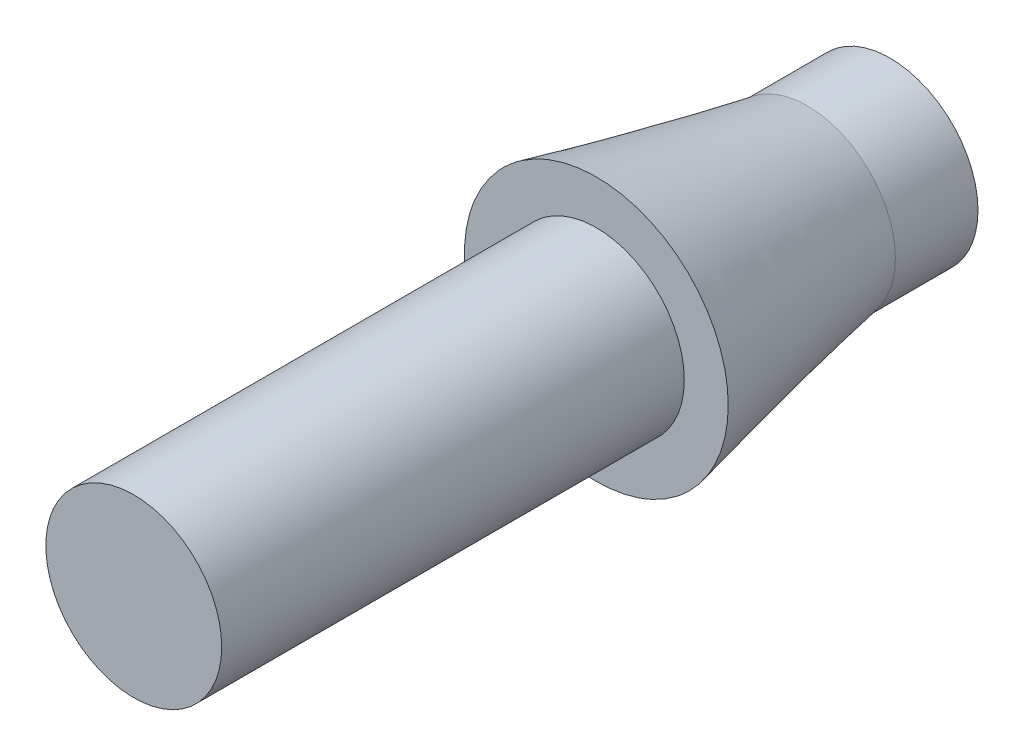
ISO-10303-21;
HEADER;
FILE_DESCRIPTION(('STEP AP214'),'2;1');
FILE_NAME('part.step','',(''),(''),'','','');
FILE_SCHEMA(('AUTOMOTIVE_DESIGN { 1 0 10303 214 1 1 1 1 }'));
ENDSEC;
DATA;
#1=APPLICATION_CONTEXT('core data for automotive mechanical design processes');
#2=APPLICATION_PROTOCOL_DEFINITION('international standard','automotive_design',2000,#1);
#3=PRODUCT_CONTEXT('',#1,'mechanical');
#4=PRODUCT('Part','Part','',(#3));
#5=PRODUCT_RELATED_PRODUCT_CATEGORY('part','',(#4));
#6=PRODUCT_DEFINITION_FORMATION('','',#4);
#7=PRODUCT_DEFINITION_CONTEXT('part definition',#1,'design');
#8=PRODUCT_DEFINITION('design','',#6,#7);
#9=PRODUCT_DEFINITION_SHAPE('','',#8);
#10=(LENGTH_UNIT() NAMED_UNIT(*) SI_UNIT(.MILLI.,.METRE.));
#11=(NAMED_UNIT(*) PLANE_ANGLE_UNIT() SI_UNIT($,.RADIAN.));
#12=(NAMED_UNIT(*) SI_UNIT($,.STERADIAN.) SOLID_ANGLE_UNIT());
#13=UNCERTAINTY_MEASURE_WITH_UNIT(LENGTH_MEASURE(1.E-05),#10,'distance_accuracy_value','');
#14=(GEOMETRIC_REPRESENTATION_CONTEXT(3) GLOBAL_UNCERTAINTY_ASSIGNED_CONTEXT((#13)) GLOBAL_UNIT_ASSIGNED_CONTEXT((#10,
#11,#12)) REPRESENTATION_CONTEXT('',''));
#15=CARTESIAN_POINT('',(0.,0.,0.));
#16=DIRECTION('',(0.,0.,1.));
#17=DIRECTION('',(1.,0.,0.));
#18=AXIS2_PLACEMENT_3D('',#15,#16,#17);
#19=CARTESIAN_POINT('',(0.,0.,43.));
#20=DIRECTION('',(0.,0.,-1.));
#21=DIRECTION('',(-1.,0.,0.));
#22=AXIS2_PLACEMENT_3D('',#19,#20,#21);
#23=CYLINDRICAL_SURFACE('',#22,5.);
#24=CARTESIAN_POINT('',(0.,0.,16.7));
#25=DIRECTION('',(0.,0.,1.));
#26=DIRECTION('',(1.,0.,0.));
#27=AXIS2_PLACEMENT_3D('',#24,#25,#26);
#28=CIRCLE('',#27,5.);
#29=CARTESIAN_POINT('',(5.,0.,16.7));
#30=VERTEX_POINT('',#29);
#31=EDGE_CURVE('E45',#30,#30,#28,.T.);
#32=ORIENTED_EDGE('',*,*,#31,.T.);
#33=EDGE_LOOP('',(#32));
#34=FACE_BOUND('',#33,.T.);
#35=CARTESIAN_POINT('',(0.,0.,43.));
#36=DIRECTION('',(0.,0.,1.));
#37=DIRECTION('',(1.,0.,0.));
#38=AXIS2_PLACEMENT_3D('',#35,#36,#37);
#39=CIRCLE('',#38,5.);
#40=CARTESIAN_POINT('',(5.,0.,43.));
#41=VERTEX_POINT('',#40);
#42=EDGE_CURVE('E49',#41,#41,#39,.T.);
#43=ORIENTED_EDGE('',*,*,#42,.F.);
#44=EDGE_LOOP('',(#43));
#45=FACE_BOUND('',#44,.T.);
#46=ADVANCED_FACE('F41',(#34,#45),#23,.T.);
#47=CARTESIAN_POINT('',(0.,0.,43.));
#48=DIRECTION('',(0.,0.,1.));
#49=DIRECTION('',(1.,0.,0.));
#50=AXIS2_PLACEMENT_3D('',#47,#48,#49);
#51=PLANE('',#50);
#52=ORIENTED_EDGE('',*,*,#42,.T.);
#53=EDGE_LOOP('',(#52));
#54=FACE_BOUND('',#53,.T.);
#55=ADVANCED_FACE('F83',(#54),#51,.T.);
#56=CARTESIAN_POINT('',(0.,0.,16.7));
#57=DIRECTION('',(0.,0.,1.));
#58=DIRECTION('',(1.,0.,0.));
#59=AXIS2_PLACEMENT_3D('',#56,#57,#58);
#60=PLANE('',#59);
#61=ORIENTED_EDGE('',*,*,#31,.F.);
#62=EDGE_LOOP('',(#61));
#63=FACE_BOUND('',#62,.T.);
#64=CARTESIAN_POINT('',(0.,0.,16.7));
#65=DIRECTION('',(0.,0.,1.));
#66=DIRECTION('',(1.,0.,0.));
#67=AXIS2_PLACEMENT_3D('',#64,#65,#66);
#68=CIRCLE('',#67,7.5);
#69=CARTESIAN_POINT('',(7.5,0.,16.7));
#70=VERTEX_POINT('',#69);
#71=EDGE_CURVE('E95',#70,#70,#68,.T.);
#72=ORIENTED_EDGE('',*,*,#71,.T.);
#73=EDGE_LOOP('',(#72));
#74=FACE_BOUND('',#73,.T.);
#75=ADVANCED_FACE('F89',(#63,#74),#60,.T.);
#76=CARTESIAN_POINT('',(3.92275643369188,-6.39233775405594,16.7));
#77=CARTESIAN_POINT('',(3.83044658146429,-3.21367064064576,4.7));
#78=CARTESIAN_POINT('',(-8.86191907442001,-14.2378506214397,16.7));
#79=CARTESIAN_POINT('',(-2.59689469982724,-10.8745638035743,4.7));
#80=CARTESIAN_POINT('',(-16.7074319418038,-1.45317511332781,16.7));
#81=CARTESIAN_POINT('',(-10.2577878627558,-4.44722252228281,4.7));
#82=CARTESIAN_POINT('',(-3.92275643369188,6.39233775405594,16.7));
#83=CARTESIAN_POINT('',(-3.83044658146429,3.21367064064576,4.7));
#84=CARTESIAN_POINT('',(8.86191907442001,14.2378506214397,16.7));
#85=CARTESIAN_POINT('',(2.59689469982724,10.8745638035743,4.7));
#86=CARTESIAN_POINT('',(16.7074319418038,1.45317511332781,16.7));
#87=CARTESIAN_POINT('',(10.2577878627558,4.44722252228281,4.7));
#88=CARTESIAN_POINT('',(3.92275643369188,-6.39233775405594,16.7));
#89=CARTESIAN_POINT('',(3.83044658146429,-3.21367064064576,4.7));
#90=(BOUNDED_SURFACE() B_SPLINE_SURFACE(3,1,((#76,#77),(#78,#79),(#80,#81),(#82,#83),(#84,#85),
(#86,#87),(#88,#89)),.UNSPECIFIED.,.T.,.F.,.F.) B_SPLINE_SURFACE_WITH_KNOTS((4,3,4),(2,2),(0.,
0.5,1.),(0.,1.),.UNSPECIFIED.) GEOMETRIC_REPRESENTATION_ITEM() RATIONAL_B_SPLINE_SURFACE(((1.,
1.),(0.333333333333333,0.333333333333333),(0.333333333333333,0.333333333333333),(1.,1.),
(0.333333333333333,0.333333333333333),(0.333333333333333,0.333333333333333),(1.,1.))) REPRESENTATION_ITEM('') SURFACE());
#91=CARTESIAN_POINT('',(3.83044658146429,-3.21367064064577,4.70000000000002));
#92=CARTESIAN_POINT('',(10.2577878627558,4.44722252228281,4.70000000000002));
#93=CARTESIAN_POINT('',(2.59689469982725,10.8745638035743,4.70000000000002));
#94=CARTESIAN_POINT('',(-3.83044658146429,3.21367064064577,4.70000000000002));
#95=CARTESIAN_POINT('',(-10.2577878627558,-4.44722252228281,4.70000000000002));
#96=CARTESIAN_POINT('',(-2.59689469982725,-10.8745638035743,4.70000000000002));
#97=CARTESIAN_POINT('',(3.83044658146429,-3.21367064064577,4.70000000000002));
#98=(BOUNDED_CURVE() B_SPLINE_CURVE(3,(#91,#92,#93,#94,#95,#96,#97),.UNSPECIFIED.,.T.,
.F.) B_SPLINE_CURVE_WITH_KNOTS((4,3,4),(0.,0.5,1.),
.UNSPECIFIED.) CURVE() GEOMETRIC_REPRESENTATION_ITEM() RATIONAL_B_SPLINE_CURVE((1.,
0.333333333333333,0.333333333333333,1.,0.333333333333333,0.333333333333333,1.)) REPRESENTATION_ITEM(''));
#99=CARTESIAN_POINT('',(3.83044658146429,-3.21367064064577,4.70000000000002));
#100=VERTEX_POINT('',#99);
#101=EDGE_CURVE('E11',#100,#100,#98,.T.);
#102=ORIENTED_EDGE('',*,*,#71,.F.);
#103=EDGE_LOOP('',(#102));
#104=FACE_BOUND('',#103,.T.);
#105=ORIENTED_EDGE('',*,*,#101,.T.);
#106=EDGE_LOOP('',(#105));
#107=FACE_BOUND('',#106,.T.);
#108=ADVANCED_FACE('F80',(#104,#107),#90,.T.);
#109=CARTESIAN_POINT('',(0.,0.,0.));
#110=DIRECTION('',(0.,0.,1.));
#111=DIRECTION('',(1.,0.,0.));
#112=AXIS2_PLACEMENT_3D('',#109,#110,#111);
#113=PLANE('',#112);
#114=CARTESIAN_POINT('',(0.,0.,0.));
#115=DIRECTION('',(0.,0.,1.));
#116=DIRECTION('',(1.,0.,0.));
#117=AXIS2_PLACEMENT_3D('',#114,#115,#116);
#118=CIRCLE('',#117,5.);
#119=CARTESIAN_POINT('',(5.,0.,0.));
#120=VERTEX_POINT('',#119);
#121=EDGE_CURVE('E54',#120,#120,#118,.T.);
#122=ORIENTED_EDGE('',*,*,#121,.F.);
#123=EDGE_LOOP('',(#122));
#124=FACE_BOUND('',#123,.T.);
#125=ADVANCED_FACE('F74',(#124),#113,.F.);
#126=ORIENTED_EDGE('',*,*,#121,.T.);
#127=EDGE_LOOP('',(#126));
#128=FACE_BOUND('',#127,.T.);
#129=ORIENTED_EDGE('',*,*,#101,.F.);
#130=EDGE_LOOP('',(#129));
#131=FACE_BOUND('',#130,.T.);
#132=ADVANCED_FACE('F72',(#128,#131),#23,.T.);
#133=CLOSED_SHELL('',(#46,#55,#75,#108,#125,#132));
#134=MANIFOLD_SOLID_BREP('B2',#133);
#135=ADVANCED_BREP_SHAPE_REPRESENTATION('',(#18,#134),#14);
#136=SHAPE_DEFINITION_REPRESENTATION(#9,#135);
ENDSEC;
END-ISO-10303-21;
